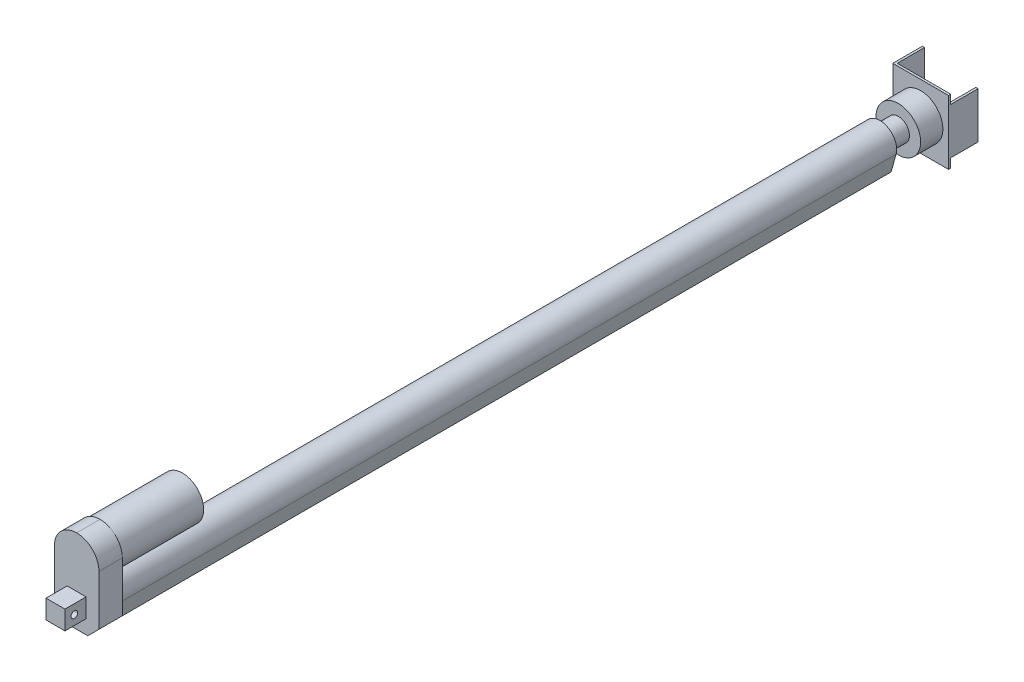
ISO-10303-21;
HEADER;
FILE_DESCRIPTION(('STEP AP214'),'2;1');
FILE_NAME('part.step','',(''),(''),'','','');
FILE_SCHEMA(('AUTOMOTIVE_DESIGN { 1 0 10303 214 1 1 1 1 }'));
ENDSEC;
DATA;
#1=APPLICATION_CONTEXT('core data for automotive mechanical design processes');
#2=APPLICATION_PROTOCOL_DEFINITION('international standard','automotive_design',2000,#1);
#3=PRODUCT_CONTEXT('',#1,'mechanical');
#4=PRODUCT('Part','Part','',(#3));
#5=PRODUCT_RELATED_PRODUCT_CATEGORY('part','',(#4));
#6=PRODUCT_DEFINITION_FORMATION('','',#4);
#7=PRODUCT_DEFINITION_CONTEXT('part definition',#1,'design');
#8=PRODUCT_DEFINITION('design','',#6,#7);
#9=PRODUCT_DEFINITION_SHAPE('','',#8);
#10=(LENGTH_UNIT() NAMED_UNIT(*) SI_UNIT(.MILLI.,.METRE.));
#11=(NAMED_UNIT(*) PLANE_ANGLE_UNIT() SI_UNIT($,.RADIAN.));
#12=(NAMED_UNIT(*) SI_UNIT($,.STERADIAN.) SOLID_ANGLE_UNIT());
#13=UNCERTAINTY_MEASURE_WITH_UNIT(LENGTH_MEASURE(1.E-05),#10,'distance_accuracy_value','');
#14=(GEOMETRIC_REPRESENTATION_CONTEXT(3) GLOBAL_UNCERTAINTY_ASSIGNED_CONTEXT((#13)) GLOBAL_UNIT_ASSIGNED_CONTEXT((#10,
#11,#12)) REPRESENTATION_CONTEXT('',''));
#15=CARTESIAN_POINT('',(0.,0.,0.));
#16=DIRECTION('',(0.,0.,1.));
#17=DIRECTION('',(1.,0.,0.));
#18=AXIS2_PLACEMENT_3D('',#15,#16,#17);
#19=CARTESIAN_POINT('',(0.,0.,-738.5));
#20=DIRECTION('',(0.,0.,-1.));
#21=DIRECTION('',(-1.,0.,0.));
#22=AXIS2_PLACEMENT_3D('',#19,#20,#21);
#23=PLANE('',#22);
#24=DIRECTION('',(0.,1.,0.));
#25=VECTOR('',#24,1.);
#26=CARTESIAN_POINT('',(23.,3.24999999999999,-738.5));
#27=LINE('',#26,#25);
#28=CARTESIAN_POINT('',(23.,-38.25,-738.5));
#29=VERTEX_POINT('',#28);
#30=CARTESIAN_POINT('',(23.,3.24999999999999,-738.5));
#31=VERTEX_POINT('',#30);
#32=EDGE_CURVE('E832',#29,#31,#27,.T.);
#33=ORIENTED_EDGE('',*,*,#32,.F.);
#34=DIRECTION('',(-1.,0.,0.));
#35=VECTOR('',#34,1.);
#36=CARTESIAN_POINT('',(25.,-38.25,-738.5));
#37=LINE('',#36,#35);
#38=CARTESIAN_POINT('',(25.,-38.25,-738.5));
#39=VERTEX_POINT('',#38);
#40=EDGE_CURVE('E849',#39,#29,#37,.T.);
#41=ORIENTED_EDGE('',*,*,#40,.F.);
#42=DIRECTION('',(0.,-1.,0.));
#43=VECTOR('',#42,1.);
#44=CARTESIAN_POINT('',(25.,11.25,-738.5));
#45=LINE('',#44,#43);
#46=CARTESIAN_POINT('',(25.,-46.25,-738.5));
#47=VERTEX_POINT('',#46);
#48=EDGE_CURVE('E239',#39,#47,#45,.T.);
#49=ORIENTED_EDGE('',*,*,#48,.T.);
#50=DIRECTION('',(-1.,0.,0.));
#51=VECTOR('',#50,1.);
#52=CARTESIAN_POINT('',(25.,-46.25,-738.5));
#53=LINE('',#52,#51);
#54=CARTESIAN_POINT('',(-23.,-46.25,-738.5));
#55=VERTEX_POINT('',#54);
#56=EDGE_CURVE('E275',#47,#55,#53,.T.);
#57=ORIENTED_EDGE('',*,*,#56,.T.);
#58=DIRECTION('',(0.,-1.,0.));
#59=VECTOR('',#58,1.);
#60=CARTESIAN_POINT('',(-23.,11.25,-738.5));
#61=LINE('',#60,#59);
#62=CARTESIAN_POINT('',(-23.,11.25,-738.5));
#63=VERTEX_POINT('',#62);
#64=EDGE_CURVE('E74',#63,#55,#61,.T.);
#65=ORIENTED_EDGE('',*,*,#64,.F.);
#66=DIRECTION('',(1.,0.,0.));
#67=VECTOR('',#66,1.);
#68=CARTESIAN_POINT('',(25.,11.25,-738.5));
#69=LINE('',#68,#67);
#70=CARTESIAN_POINT('',(25.,11.25,-738.5));
#71=VERTEX_POINT('',#70);
#72=EDGE_CURVE('E278',#63,#71,#69,.T.);
#73=ORIENTED_EDGE('',*,*,#72,.T.);
#74=CARTESIAN_POINT('',(25.,3.24999999999999,-738.5));
#75=VERTEX_POINT('',#74);
#76=EDGE_CURVE('E271',#71,#75,#45,.T.);
#77=ORIENTED_EDGE('',*,*,#76,.T.);
#78=DIRECTION('',(1.,0.,0.));
#79=VECTOR('',#78,1.);
#80=CARTESIAN_POINT('',(25.,3.24999999999999,-738.5));
#81=LINE('',#80,#79);
#82=EDGE_CURVE('E233',#31,#75,#81,.T.);
#83=ORIENTED_EDGE('',*,*,#82,.F.);
#84=EDGE_LOOP('',(#33,#41,#49,#57,#65,#73,#77,#83));
#85=FACE_BOUND('',#84,.T.);
#86=ADVANCED_FACE('F47',(#85),#23,.T.);
#87=CARTESIAN_POINT('',(0.,0.,0.));
#88=DIRECTION('',(0.,0.,1.));
#89=DIRECTION('',(1.,0.,0.));
#90=AXIS2_PLACEMENT_3D('',#87,#88,#89);
#91=PLANE('',#90);
#92=CARTESIAN_POINT('',(0.,17.5,0.));
#93=DIRECTION('',(0.,0.,1.));
#94=DIRECTION('',(1.,0.,0.));
#95=AXIS2_PLACEMENT_3D('',#92,#93,#94);
#96=CIRCLE('',#95,19.);
#97=CARTESIAN_POINT('',(19.,17.5,0.));
#98=VERTEX_POINT('',#97);
#99=EDGE_CURVE('E58',#98,#98,#96,.F.);
#100=ORIENTED_EDGE('',*,*,#99,.F.);
#101=EDGE_LOOP('',(#100));
#102=FACE_BOUND('',#101,.T.);
#103=DIRECTION('',(-0.26833752096446,0.96332495807108,0.));
#104=VECTOR('',#103,1.);
#105=CARTESIAN_POINT('',(-10.,-37.5,0.));
#106=LINE('',#105,#104);
#107=CARTESIAN_POINT('',(-10.,-37.5,0.));
#108=VERTEX_POINT('',#107);
#109=CARTESIAN_POINT('',(-14.4498743710662,-21.5250628144669,0.));
#110=VERTEX_POINT('',#109);
#111=EDGE_CURVE('E379',#108,#110,#106,.T.);
#112=ORIENTED_EDGE('',*,*,#111,.F.);
#113=DIRECTION('',(0.707106781186546,-0.707106781186549,0.));
#114=VECTOR('',#113,1.);
#115=CARTESIAN_POINT('',(-10.,-37.5,0.));
#116=LINE('',#115,#114);
#117=CARTESIAN_POINT('',(-20.,-27.5,0.));
#118=VERTEX_POINT('',#117);
#119=EDGE_CURVE('E468',#108,#118,#116,.F.);
#120=ORIENTED_EDGE('',*,*,#119,.T.);
#121=DIRECTION('',(0.,-1.,0.));
#122=VECTOR('',#121,1.);
#123=CARTESIAN_POINT('',(-20.,37.5,0.));
#124=LINE('',#123,#122);
#125=CARTESIAN_POINT('',(-20.,17.5,0.));
#126=VERTEX_POINT('',#125);
#127=EDGE_CURVE('E428',#126,#118,#124,.T.);
#128=ORIENTED_EDGE('',*,*,#127,.F.);
#129=CARTESIAN_POINT('',(0.,17.5,0.));
#130=DIRECTION('',(0.,0.,1.));
#131=DIRECTION('',(1.,0.,0.));
#132=AXIS2_PLACEMENT_3D('',#129,#130,#131);
#133=CIRCLE('',#132,20.);
#134=CARTESIAN_POINT('',(0.,37.5,0.));
#135=VERTEX_POINT('',#134);
#136=EDGE_CURVE('E441',#126,#135,#133,.F.);
#137=ORIENTED_EDGE('',*,*,#136,.T.);
#138=CARTESIAN_POINT('',(0.,17.5,0.));
#139=DIRECTION('',(0.,0.,1.));
#140=DIRECTION('',(1.,0.,0.));
#141=AXIS2_PLACEMENT_3D('',#138,#139,#140);
#142=CIRCLE('',#141,20.);
#143=CARTESIAN_POINT('',(20.,17.5,0.));
#144=VERTEX_POINT('',#143);
#145=EDGE_CURVE('E437',#135,#144,#142,.F.);
#146=ORIENTED_EDGE('',*,*,#145,.T.);
#147=DIRECTION('',(0.,1.,0.));
#148=VECTOR('',#147,1.);
#149=CARTESIAN_POINT('',(20.,37.5,0.));
#150=LINE('',#149,#148);
#151=CARTESIAN_POINT('',(20.,-27.5,0.));
#152=VERTEX_POINT('',#151);
#153=EDGE_CURVE('E420',#152,#144,#150,.T.);
#154=ORIENTED_EDGE('',*,*,#153,.F.);
#155=DIRECTION('',(0.707106781186548,0.707106781186547,0.));
#156=VECTOR('',#155,1.);
#157=CARTESIAN_POINT('',(20.,-27.5,0.));
#158=LINE('',#157,#156);
#159=CARTESIAN_POINT('',(9.99999999999996,-37.5,0.));
#160=VERTEX_POINT('',#159);
#161=EDGE_CURVE('E464',#152,#160,#158,.F.);
#162=ORIENTED_EDGE('',*,*,#161,.T.);
#163=DIRECTION('',(-0.268337520964462,-0.963324958071079,0.));
#164=VECTOR('',#163,1.);
#165=CARTESIAN_POINT('',(9.99999999999996,-37.5,0.));
#166=LINE('',#165,#164);
#167=CARTESIAN_POINT('',(14.4498743710662,-21.5250628144669,0.));
#168=VERTEX_POINT('',#167);
#169=EDGE_CURVE('E392',#168,#160,#166,.T.);
#170=ORIENTED_EDGE('',*,*,#169,.F.);
#171=CARTESIAN_POINT('',(0.,-17.5,0.));
#172=DIRECTION('',(0.,0.,-1.));
#173=DIRECTION('',(-1.,0.,0.));
#174=AXIS2_PLACEMENT_3D('',#171,#172,#173);
#175=CIRCLE('',#174,15.);
#176=EDGE_CURVE('E373',#110,#168,#175,.T.);
#177=ORIENTED_EDGE('',*,*,#176,.F.);
#178=EDGE_LOOP('',(#112,#120,#128,#137,#146,#154,#162,#170,#177));
#179=FACE_BOUND('',#178,.T.);
#180=ADVANCED_FACE('F489',(#102,#179),#91,.F.);
#181=CARTESIAN_POINT('',(-20.,37.5,21.));
#182=DIRECTION('',(1.,0.,0.));
#183=DIRECTION('',(0.,1.,0.));
#184=AXIS2_PLACEMENT_3D('',#181,#182,#183);
#185=PLANE('',#184);
#186=ORIENTED_EDGE('',*,*,#127,.T.);
#187=DIRECTION('',(0.,0.,1.));
#188=VECTOR('',#187,1.);
#189=CARTESIAN_POINT('',(-20.,-27.5,21.));
#190=LINE('',#189,#188);
#191=CARTESIAN_POINT('',(-20.,-27.5,21.));
#192=VERTEX_POINT('',#191);
#193=EDGE_CURVE('E471',#118,#192,#190,.T.);
#194=ORIENTED_EDGE('',*,*,#193,.T.);
#195=DIRECTION('',(0.,-1.,0.));
#196=VECTOR('',#195,1.);
#197=CARTESIAN_POINT('',(-20.,37.5,21.));
#198=LINE('',#197,#196);
#199=CARTESIAN_POINT('',(-20.,17.5,21.));
#200=VERTEX_POINT('',#199);
#201=EDGE_CURVE('E415',#200,#192,#198,.T.);
#202=ORIENTED_EDGE('',*,*,#201,.F.);
#203=DIRECTION('',(0.,0.,-1.));
#204=VECTOR('',#203,1.);
#205=CARTESIAN_POINT('',(-20.,17.5,21.));
#206=LINE('',#205,#204);
#207=EDGE_CURVE('E427',#200,#126,#206,.T.);
#208=ORIENTED_EDGE('',*,*,#207,.T.);
#209=EDGE_LOOP('',(#186,#194,#202,#208));
#210=FACE_BOUND('',#209,.T.);
#211=ADVANCED_FACE('F492',(#210),#185,.F.);
#212=CARTESIAN_POINT('',(-20.,-37.5,21.));
#213=DIRECTION('',(0.,1.,0.));
#214=DIRECTION('',(-1.,0.,0.));
#215=AXIS2_PLACEMENT_3D('',#212,#213,#214);
#216=PLANE('',#215);
#217=DIRECTION('',(1.,0.,0.));
#218=VECTOR('',#217,1.);
#219=CARTESIAN_POINT('',(-20.,-37.5,21.));
#220=LINE('',#219,#218);
#221=CARTESIAN_POINT('',(-10.,-37.5,21.));
#222=VERTEX_POINT('',#221);
#223=CARTESIAN_POINT('',(9.99999999999996,-37.5,21.));
#224=VERTEX_POINT('',#223);
#225=EDGE_CURVE('E419',#222,#224,#220,.T.);
#226=ORIENTED_EDGE('',*,*,#225,.F.);
#227=DIRECTION('',(0.,0.,-1.));
#228=VECTOR('',#227,1.);
#229=CARTESIAN_POINT('',(-10.,-37.5,21.));
#230=LINE('',#229,#228);
#231=EDGE_CURVE('E460',#222,#108,#230,.T.);
#232=ORIENTED_EDGE('',*,*,#231,.T.);
#233=DIRECTION('',(0.,0.,1.));
#234=VECTOR('',#233,1.);
#235=CARTESIAN_POINT('',(-10.,-37.5,-700.));
#236=LINE('',#235,#234);
#237=CARTESIAN_POINT('',(-10.,-37.5,-700.));
#238=VERTEX_POINT('',#237);
#239=EDGE_CURVE('E402',#238,#108,#236,.T.);
#240=ORIENTED_EDGE('',*,*,#239,.F.);
#241=DIRECTION('',(-1.,0.,0.));
#242=VECTOR('',#241,1.);
#243=CARTESIAN_POINT('',(9.99999999999996,-37.5,-700.));
#244=LINE('',#243,#242);
#245=CARTESIAN_POINT('',(9.99999999999996,-37.5,-700.));
#246=VERTEX_POINT('',#245);
#247=EDGE_CURVE('E382',#246,#238,#244,.T.);
#248=ORIENTED_EDGE('',*,*,#247,.F.);
#249=DIRECTION('',(0.,0.,1.));
#250=VECTOR('',#249,1.);
#251=CARTESIAN_POINT('',(9.99999999999996,-37.5,-700.));
#252=LINE('',#251,#250);
#253=EDGE_CURVE('E406',#246,#160,#252,.T.);
#254=ORIENTED_EDGE('',*,*,#253,.T.);
#255=DIRECTION('',(0.,0.,1.));
#256=VECTOR('',#255,1.);
#257=CARTESIAN_POINT('',(9.99999999999996,-37.5,21.));
#258=LINE('',#257,#256);
#259=EDGE_CURVE('E454',#160,#224,#258,.T.);
#260=ORIENTED_EDGE('',*,*,#259,.T.);
#261=EDGE_LOOP('',(#226,#232,#240,#248,#254,#260));
#262=FACE_BOUND('',#261,.T.);
#263=ADVANCED_FACE('F506',(#262),#216,.F.);
#264=CARTESIAN_POINT('',(20.,37.5,21.));
#265=DIRECTION('',(-1.,0.,0.));
#266=DIRECTION('',(0.,-1.,0.));
#267=AXIS2_PLACEMENT_3D('',#264,#265,#266);
#268=PLANE('',#267);
#269=DIRECTION('',(0.,1.,0.));
#270=VECTOR('',#269,1.);
#271=CARTESIAN_POINT('',(20.,37.5,21.));
#272=LINE('',#271,#270);
#273=CARTESIAN_POINT('',(20.,-27.5,21.));
#274=VERTEX_POINT('',#273);
#275=CARTESIAN_POINT('',(20.,17.5,21.));
#276=VERTEX_POINT('',#275);
#277=EDGE_CURVE('E424',#274,#276,#272,.T.);
#278=ORIENTED_EDGE('',*,*,#277,.F.);
#279=DIRECTION('',(0.,0.,-1.));
#280=VECTOR('',#279,1.);
#281=CARTESIAN_POINT('',(20.,-27.5,21.));
#282=LINE('',#281,#280);
#283=EDGE_CURVE('E480',#274,#152,#282,.T.);
#284=ORIENTED_EDGE('',*,*,#283,.T.);
#285=ORIENTED_EDGE('',*,*,#153,.T.);
#286=DIRECTION('',(0.,0.,-1.));
#287=VECTOR('',#286,1.);
#288=CARTESIAN_POINT('',(20.,17.5,21.));
#289=LINE('',#288,#287);
#290=EDGE_CURVE('E450',#144,#276,#289,.F.);
#291=ORIENTED_EDGE('',*,*,#290,.T.);
#292=EDGE_LOOP('',(#278,#284,#285,#291));
#293=FACE_BOUND('',#292,.T.);
#294=ADVANCED_FACE('F523',(#293),#268,.F.);
#295=CARTESIAN_POINT('',(0.,0.,21.));
#296=DIRECTION('',(0.,0.,1.));
#297=DIRECTION('',(1.,0.,0.));
#298=AXIS2_PLACEMENT_3D('',#295,#296,#297);
#299=PLANE('',#298);
#300=DIRECTION('',(0.,-1.,0.));
#301=VECTOR('',#300,1.);
#302=CARTESIAN_POINT('',(-8.5,-8.,21.));
#303=LINE('',#302,#301);
#304=CARTESIAN_POINT('',(-8.5,-8.,21.));
#305=VERTEX_POINT('',#304);
#306=CARTESIAN_POINT('',(-8.5,-25.,21.));
#307=VERTEX_POINT('',#306);
#308=EDGE_CURVE('E339',#305,#307,#303,.T.);
#309=ORIENTED_EDGE('',*,*,#308,.F.);
#310=DIRECTION('',(-1.,0.,0.));
#311=VECTOR('',#310,1.);
#312=CARTESIAN_POINT('',(-8.5,-8.,21.));
#313=LINE('',#312,#311);
#314=CARTESIAN_POINT('',(8.5,-8.,21.));
#315=VERTEX_POINT('',#314);
#316=EDGE_CURVE('E329',#315,#305,#313,.T.);
#317=ORIENTED_EDGE('',*,*,#316,.F.);
#318=DIRECTION('',(0.,1.,0.));
#319=VECTOR('',#318,1.);
#320=CARTESIAN_POINT('',(8.5,-8.,21.));
#321=LINE('',#320,#319);
#322=CARTESIAN_POINT('',(8.5,-25.,21.));
#323=VERTEX_POINT('',#322);
#324=EDGE_CURVE('E347',#323,#315,#321,.T.);
#325=ORIENTED_EDGE('',*,*,#324,.F.);
#326=DIRECTION('',(1.,0.,0.));
#327=VECTOR('',#326,1.);
#328=CARTESIAN_POINT('',(-8.5,-25.,21.));
#329=LINE('',#328,#327);
#330=EDGE_CURVE('E343',#307,#323,#329,.T.);
#331=ORIENTED_EDGE('',*,*,#330,.F.);
#332=EDGE_LOOP('',(#309,#317,#325,#331));
#333=FACE_BOUND('',#332,.T.);
#334=ORIENTED_EDGE('',*,*,#201,.T.);
#335=DIRECTION('',(-0.707106781186546,0.707106781186549,0.));
#336=VECTOR('',#335,1.);
#337=CARTESIAN_POINT('',(-23.75,-23.7499999999999,21.));
#338=LINE('',#337,#336);
#339=EDGE_CURVE('E477',#192,#222,#338,.F.);
#340=ORIENTED_EDGE('',*,*,#339,.T.);
#341=ORIENTED_EDGE('',*,*,#225,.T.);
#342=DIRECTION('',(-0.707106781186548,-0.707106781186547,0.));
#343=VECTOR('',#342,1.);
#344=CARTESIAN_POINT('',(23.75,-23.75,21.));
#345=LINE('',#344,#343);
#346=EDGE_CURVE('E474',#224,#274,#345,.F.);
#347=ORIENTED_EDGE('',*,*,#346,.T.);
#348=ORIENTED_EDGE('',*,*,#277,.T.);
#349=CARTESIAN_POINT('',(0.,17.5,21.));
#350=DIRECTION('',(0.,0.,1.));
#351=DIRECTION('',(1.,0.,0.));
#352=AXIS2_PLACEMENT_3D('',#349,#350,#351);
#353=CIRCLE('',#352,20.);
#354=CARTESIAN_POINT('',(0.,37.5,21.));
#355=VERTEX_POINT('',#354);
#356=EDGE_CURVE('E444',#276,#355,#353,.T.);
#357=ORIENTED_EDGE('',*,*,#356,.T.);
#358=CARTESIAN_POINT('',(0.,17.5,21.));
#359=DIRECTION('',(0.,0.,1.));
#360=DIRECTION('',(1.,0.,0.));
#361=AXIS2_PLACEMENT_3D('',#358,#359,#360);
#362=CIRCLE('',#361,20.);
#363=EDGE_CURVE('E447',#355,#200,#362,.T.);
#364=ORIENTED_EDGE('',*,*,#363,.T.);
#365=EDGE_LOOP('',(#334,#340,#341,#347,#348,#357,#364));
#366=FACE_BOUND('',#365,.T.);
#367=ADVANCED_FACE('F527',(#333,#366),#299,.T.);
#368=CARTESIAN_POINT('',(0.,17.5,21.));
#369=DIRECTION('',(0.,0.,-1.));
#370=DIRECTION('',(-1.,0.,0.));
#371=AXIS2_PLACEMENT_3D('',#368,#369,#370);
#372=CYLINDRICAL_SURFACE('',#371,20.);
#373=DIRECTION('',(0.,0.,-1.));
#374=VECTOR('',#373,1.);
#375=CARTESIAN_POINT('',(0.,37.5,21.));
#376=LINE('',#375,#374);
#377=EDGE_CURVE('E414',#355,#135,#376,.T.);
#378=ORIENTED_EDGE('',*,*,#377,.F.);
#379=ORIENTED_EDGE('',*,*,#356,.F.);
#380=ORIENTED_EDGE('',*,*,#290,.F.);
#381=ORIENTED_EDGE('',*,*,#145,.F.);
#382=EDGE_LOOP('',(#378,#379,#380,#381));
#383=FACE_BOUND('',#382,.T.);
#384=ADVANCED_FACE('F537',(#383),#372,.T.);
#385=CARTESIAN_POINT('',(0.,17.5,21.));
#386=DIRECTION('',(0.,0.,-1.));
#387=DIRECTION('',(-1.,0.,0.));
#388=AXIS2_PLACEMENT_3D('',#385,#386,#387);
#389=CYLINDRICAL_SURFACE('',#388,20.);
#390=ORIENTED_EDGE('',*,*,#363,.F.);
#391=ORIENTED_EDGE('',*,*,#377,.T.);
#392=ORIENTED_EDGE('',*,*,#136,.F.);
#393=ORIENTED_EDGE('',*,*,#207,.F.);
#394=EDGE_LOOP('',(#390,#391,#392,#393));
#395=FACE_BOUND('',#394,.T.);
#396=ADVANCED_FACE('F534',(#395),#389,.T.);
#397=CARTESIAN_POINT('',(-10.,-37.5,21.));
#398=DIRECTION('',(0.707106781186549,0.707106781186546,0.));
#399=DIRECTION('',(0.,0.,-1.));
#400=AXIS2_PLACEMENT_3D('',#397,#398,#399);
#401=PLANE('',#400);
#402=ORIENTED_EDGE('',*,*,#339,.F.);
#403=ORIENTED_EDGE('',*,*,#193,.F.);
#404=ORIENTED_EDGE('',*,*,#119,.F.);
#405=ORIENTED_EDGE('',*,*,#231,.F.);
#406=EDGE_LOOP('',(#402,#403,#404,#405));
#407=FACE_BOUND('',#406,.T.);
#408=ADVANCED_FACE('F502',(#407),#401,.F.);
#409=CARTESIAN_POINT('',(20.,-27.5,21.));
#410=DIRECTION('',(-0.707106781186547,0.707106781186548,0.));
#411=DIRECTION('',(0.,0.,-1.));
#412=AXIS2_PLACEMENT_3D('',#409,#410,#411);
#413=PLANE('',#412);
#414=ORIENTED_EDGE('',*,*,#346,.F.);
#415=ORIENTED_EDGE('',*,*,#259,.F.);
#416=ORIENTED_EDGE('',*,*,#161,.F.);
#417=ORIENTED_EDGE('',*,*,#283,.F.);
#418=EDGE_LOOP('',(#414,#415,#416,#417));
#419=FACE_BOUND('',#418,.T.);
#420=ADVANCED_FACE('F50',(#419),#413,.F.);
#421=CARTESIAN_POINT('',(0.,-17.5,-700.));
#422=DIRECTION('',(0.,0.,1.));
#423=DIRECTION('',(1.,0.,0.));
#424=AXIS2_PLACEMENT_3D('',#421,#422,#423);
#425=CYLINDRICAL_SURFACE('',#424,15.);
#426=ORIENTED_EDGE('',*,*,#176,.T.);
#427=DIRECTION('',(0.,0.,1.));
#428=VECTOR('',#427,1.);
#429=CARTESIAN_POINT('',(14.4498743710662,-21.5250628144669,-700.));
#430=LINE('',#429,#428);
#431=CARTESIAN_POINT('',(14.4498743710662,-21.5250628144669,-700.));
#432=VERTEX_POINT('',#431);
#433=EDGE_CURVE('E410',#432,#168,#430,.T.);
#434=ORIENTED_EDGE('',*,*,#433,.F.);
#435=CARTESIAN_POINT('',(0.,-17.5,-700.));
#436=DIRECTION('',(0.,0.,-1.));
#437=DIRECTION('',(-1.,0.,0.));
#438=AXIS2_PLACEMENT_3D('',#435,#436,#437);
#439=CIRCLE('',#438,15.);
#440=CARTESIAN_POINT('',(-14.4498743710662,-21.5250628144669,-700.));
#441=VERTEX_POINT('',#440);
#442=EDGE_CURVE('E374',#441,#432,#439,.T.);
#443=ORIENTED_EDGE('',*,*,#442,.F.);
#444=DIRECTION('',(0.,0.,1.));
#445=VECTOR('',#444,1.);
#446=CARTESIAN_POINT('',(-14.4498743710662,-21.5250628144669,-700.));
#447=LINE('',#446,#445);
#448=EDGE_CURVE('E388',#441,#110,#447,.T.);
#449=ORIENTED_EDGE('',*,*,#448,.T.);
#450=EDGE_LOOP('',(#426,#434,#443,#449));
#451=FACE_BOUND('',#450,.T.);
#452=ADVANCED_FACE('F625',(#451),#425,.T.);
#453=CARTESIAN_POINT('',(9.99999999999996,-37.5,-700.));
#454=DIRECTION('',(-0.963324958071079,0.268337520964462,0.));
#455=DIRECTION('',(-0.268337520964462,-0.963324958071079,0.));
#456=AXIS2_PLACEMENT_3D('',#453,#454,#455);
#457=PLANE('',#456);
#458=ORIENTED_EDGE('',*,*,#169,.T.);
#459=ORIENTED_EDGE('',*,*,#253,.F.);
#460=DIRECTION('',(-0.268337520964462,-0.963324958071079,0.));
#461=VECTOR('',#460,1.);
#462=CARTESIAN_POINT('',(9.99999999999996,-37.5,-700.));
#463=LINE('',#462,#461);
#464=EDGE_CURVE('E378',#432,#246,#463,.T.);
#465=ORIENTED_EDGE('',*,*,#464,.F.);
#466=ORIENTED_EDGE('',*,*,#433,.T.);
#467=EDGE_LOOP('',(#458,#459,#465,#466));
#468=FACE_BOUND('',#467,.T.);
#469=ADVANCED_FACE('F516',(#468),#457,.F.);
#470=CARTESIAN_POINT('',(-10.,-37.5,-700.));
#471=DIRECTION('',(0.96332495807108,0.26833752096446,0.));
#472=DIRECTION('',(-0.26833752096446,0.96332495807108,0.));
#473=AXIS2_PLACEMENT_3D('',#470,#471,#472);
#474=PLANE('',#473);
#475=ORIENTED_EDGE('',*,*,#111,.T.);
#476=ORIENTED_EDGE('',*,*,#448,.F.);
#477=DIRECTION('',(-0.26833752096446,0.96332495807108,0.));
#478=VECTOR('',#477,1.);
#479=CARTESIAN_POINT('',(-10.,-37.5,-700.));
#480=LINE('',#479,#478);
#481=EDGE_CURVE('E385',#238,#441,#480,.T.);
#482=ORIENTED_EDGE('',*,*,#481,.F.);
#483=ORIENTED_EDGE('',*,*,#239,.T.);
#484=EDGE_LOOP('',(#475,#476,#482,#483));
#485=FACE_BOUND('',#484,.T.);
#486=ADVANCED_FACE('F509',(#485),#474,.F.);
#487=CARTESIAN_POINT('',(0.,-17.5,-700.));
#488=DIRECTION('',(0.,0.,-1.));
#489=DIRECTION('',(-1.,0.,0.));
#490=AXIS2_PLACEMENT_3D('',#487,#488,#489);
#491=PLANE('',#490);
#492=CARTESIAN_POINT('',(0.,-17.5,-700.));
#493=DIRECTION('',(0.,0.,-1.));
#494=DIRECTION('',(-1.,0.,0.));
#495=AXIS2_PLACEMENT_3D('',#492,#493,#494);
#496=CIRCLE('',#495,10.);
#497=CARTESIAN_POINT('',(-10.,-17.5,-700.));
#498=VERTEX_POINT('',#497);
#499=EDGE_CURVE('E11',#498,#498,#496,.T.);
#500=ORIENTED_EDGE('',*,*,#499,.F.);
#501=EDGE_LOOP('',(#500));
#502=FACE_BOUND('',#501,.T.);
#503=ORIENTED_EDGE('',*,*,#442,.T.);
#504=ORIENTED_EDGE('',*,*,#464,.T.);
#505=ORIENTED_EDGE('',*,*,#247,.T.);
#506=ORIENTED_EDGE('',*,*,#481,.T.);
#507=EDGE_LOOP('',(#503,#504,#505,#506));
#508=FACE_BOUND('',#507,.T.);
#509=ADVANCED_FACE('F512',(#502,#508),#491,.T.);
#510=CARTESIAN_POINT('',(0.,17.5,-74.));
#511=DIRECTION('',(0.,0.,1.));
#512=DIRECTION('',(1.,0.,0.));
#513=AXIS2_PLACEMENT_3D('',#510,#511,#512);
#514=CYLINDRICAL_SURFACE('',#513,19.);
#515=CARTESIAN_POINT('',(0.,17.5,-74.));
#516=DIRECTION('',(0.,0.,-1.));
#517=DIRECTION('',(-1.,0.,0.));
#518=AXIS2_PLACEMENT_3D('',#515,#516,#517);
#519=CIRCLE('',#518,19.);
#520=CARTESIAN_POINT('',(-19.,17.5,-74.));
#521=VERTEX_POINT('',#520);
#522=EDGE_CURVE('E369',#521,#521,#519,.T.);
#523=ORIENTED_EDGE('',*,*,#522,.F.);
#524=EDGE_LOOP('',(#523));
#525=FACE_BOUND('',#524,.T.);
#526=ORIENTED_EDGE('',*,*,#99,.T.);
#527=EDGE_LOOP('',(#526));
#528=FACE_BOUND('',#527,.T.);
#529=ADVANCED_FACE('F487',(#525,#528),#514,.T.);
#530=CARTESIAN_POINT('',(0.,17.5,-74.));
#531=DIRECTION('',(0.,0.,-1.));
#532=DIRECTION('',(-1.,0.,0.));
#533=AXIS2_PLACEMENT_3D('',#530,#531,#532);
#534=PLANE('',#533);
#535=ORIENTED_EDGE('',*,*,#522,.T.);
#536=EDGE_LOOP('',(#535));
#537=FACE_BOUND('',#536,.T.);
#538=ADVANCED_FACE('F610',(#537),#534,.T.);
#539=CARTESIAN_POINT('',(-8.5,-8.,40.));
#540=DIRECTION('',(1.,0.,0.));
#541=DIRECTION('',(0.,1.,0.));
#542=AXIS2_PLACEMENT_3D('',#539,#540,#541);
#543=PLANE('',#542);
#544=CARTESIAN_POINT('',(-8.5,-16.5,31.5));
#545=DIRECTION('',(-1.,0.,0.));
#546=DIRECTION('',(0.,-1.,0.));
#547=AXIS2_PLACEMENT_3D('',#544,#545,#546);
#548=CIRCLE('',#547,3.);
#549=CARTESIAN_POINT('',(-8.5,-19.5,31.5));
#550=VERTEX_POINT('',#549);
#551=EDGE_CURVE('E319',#550,#550,#548,.T.);
#552=ORIENTED_EDGE('',*,*,#551,.F.);
#553=EDGE_LOOP('',(#552));
#554=FACE_BOUND('',#553,.T.);
#555=ORIENTED_EDGE('',*,*,#308,.T.);
#556=DIRECTION('',(0.,0.,-1.));
#557=VECTOR('',#556,1.);
#558=CARTESIAN_POINT('',(-8.5,-25.,40.));
#559=LINE('',#558,#557);
#560=CARTESIAN_POINT('',(-8.5,-25.,40.));
#561=VERTEX_POINT('',#560);
#562=EDGE_CURVE('E365',#561,#307,#559,.T.);
#563=ORIENTED_EDGE('',*,*,#562,.F.);
#564=DIRECTION('',(0.,-1.,0.));
#565=VECTOR('',#564,1.);
#566=CARTESIAN_POINT('',(-8.5,-8.,40.));
#567=LINE('',#566,#565);
#568=CARTESIAN_POINT('',(-8.5,-8.,40.));
#569=VERTEX_POINT('',#568);
#570=EDGE_CURVE('E324',#569,#561,#567,.T.);
#571=ORIENTED_EDGE('',*,*,#570,.F.);
#572=DIRECTION('',(0.,0.,-1.));
#573=VECTOR('',#572,1.);
#574=CARTESIAN_POINT('',(-8.5,-8.,40.));
#575=LINE('',#574,#573);
#576=EDGE_CURVE('E338',#569,#305,#575,.T.);
#577=ORIENTED_EDGE('',*,*,#576,.T.);
#578=EDGE_LOOP('',(#555,#563,#571,#577));
#579=FACE_BOUND('',#578,.T.);
#580=ADVANCED_FACE('F606',(#554,#579),#543,.F.);
#581=CARTESIAN_POINT('',(-8.5,-25.,40.));
#582=DIRECTION('',(0.,1.,0.));
#583=DIRECTION('',(0.,0.,1.));
#584=AXIS2_PLACEMENT_3D('',#581,#582,#583);
#585=PLANE('',#584);
#586=ORIENTED_EDGE('',*,*,#330,.T.);
#587=DIRECTION('',(0.,0.,-1.));
#588=VECTOR('',#587,1.);
#589=CARTESIAN_POINT('',(8.5,-25.,40.));
#590=LINE('',#589,#588);
#591=CARTESIAN_POINT('',(8.5,-25.,40.));
#592=VERTEX_POINT('',#591);
#593=EDGE_CURVE('E361',#592,#323,#590,.T.);
#594=ORIENTED_EDGE('',*,*,#593,.F.);
#595=DIRECTION('',(1.,0.,0.));
#596=VECTOR('',#595,1.);
#597=CARTESIAN_POINT('',(-8.5,-25.,40.));
#598=LINE('',#597,#596);
#599=EDGE_CURVE('E328',#561,#592,#598,.T.);
#600=ORIENTED_EDGE('',*,*,#599,.F.);
#601=ORIENTED_EDGE('',*,*,#562,.T.);
#602=EDGE_LOOP('',(#586,#594,#600,#601));
#603=FACE_BOUND('',#602,.T.);
#604=ADVANCED_FACE('F602',(#603),#585,.F.);
#605=CARTESIAN_POINT('',(8.5,-8.,40.));
#606=DIRECTION('',(-1.,0.,0.));
#607=DIRECTION('',(0.,0.,1.));
#608=AXIS2_PLACEMENT_3D('',#605,#606,#607);
#609=PLANE('',#608);
#610=CARTESIAN_POINT('',(8.5,-16.5,31.5));
#611=DIRECTION('',(-1.,0.,0.));
#612=DIRECTION('',(0.,0.,1.));
#613=AXIS2_PLACEMENT_3D('',#610,#611,#612);
#614=CIRCLE('',#613,3.);
#615=CARTESIAN_POINT('',(8.5,-16.5,34.5));
#616=VERTEX_POINT('',#615);
#617=EDGE_CURVE('E52',#616,#616,#614,.T.);
#618=ORIENTED_EDGE('',*,*,#617,.T.);
#619=EDGE_LOOP('',(#618));
#620=FACE_BOUND('',#619,.T.);
#621=ORIENTED_EDGE('',*,*,#324,.T.);
#622=DIRECTION('',(0.,0.,-1.));
#623=VECTOR('',#622,1.);
#624=CARTESIAN_POINT('',(8.5,-8.,40.));
#625=LINE('',#624,#623);
#626=CARTESIAN_POINT('',(8.5,-8.,40.));
#627=VERTEX_POINT('',#626);
#628=EDGE_CURVE('E357',#627,#315,#625,.T.);
#629=ORIENTED_EDGE('',*,*,#628,.F.);
#630=DIRECTION('',(0.,1.,0.));
#631=VECTOR('',#630,1.);
#632=CARTESIAN_POINT('',(8.5,-8.,40.));
#633=LINE('',#632,#631);
#634=EDGE_CURVE('E332',#592,#627,#633,.T.);
#635=ORIENTED_EDGE('',*,*,#634,.F.);
#636=ORIENTED_EDGE('',*,*,#593,.T.);
#637=EDGE_LOOP('',(#621,#629,#635,#636));
#638=FACE_BOUND('',#637,.T.);
#639=ADVANCED_FACE('F598',(#620,#638),#609,.F.);
#640=CARTESIAN_POINT('',(-8.5,-8.,40.));
#641=DIRECTION('',(0.,-1.,0.));
#642=DIRECTION('',(0.,0.,-1.));
#643=AXIS2_PLACEMENT_3D('',#640,#641,#642);
#644=PLANE('',#643);
#645=ORIENTED_EDGE('',*,*,#316,.T.);
#646=ORIENTED_EDGE('',*,*,#576,.F.);
#647=DIRECTION('',(-1.,0.,0.));
#648=VECTOR('',#647,1.);
#649=CARTESIAN_POINT('',(-8.5,-8.,40.));
#650=LINE('',#649,#648);
#651=EDGE_CURVE('E335',#627,#569,#650,.T.);
#652=ORIENTED_EDGE('',*,*,#651,.F.);
#653=ORIENTED_EDGE('',*,*,#628,.T.);
#654=EDGE_LOOP('',(#645,#646,#652,#653));
#655=FACE_BOUND('',#654,.T.);
#656=ADVANCED_FACE('F594',(#655),#644,.F.);
#657=CARTESIAN_POINT('',(0.,0.,40.));
#658=DIRECTION('',(0.,0.,1.));
#659=DIRECTION('',(1.,0.,0.));
#660=AXIS2_PLACEMENT_3D('',#657,#658,#659);
#661=PLANE('',#660);
#662=ORIENTED_EDGE('',*,*,#570,.T.);
#663=ORIENTED_EDGE('',*,*,#599,.T.);
#664=ORIENTED_EDGE('',*,*,#634,.T.);
#665=ORIENTED_EDGE('',*,*,#651,.T.);
#666=EDGE_LOOP('',(#662,#663,#664,#665));
#667=FACE_BOUND('',#666,.T.);
#668=ADVANCED_FACE('F590',(#667),#661,.T.);
#669=CARTESIAN_POINT('',(10.5,-16.5,31.5));
#670=DIRECTION('',(-1.,0.,0.));
#671=DIRECTION('',(0.,-1.,0.));
#672=AXIS2_PLACEMENT_3D('',#669,#670,#671);
#673=CYLINDRICAL_SURFACE('',#672,3.);
#674=ORIENTED_EDGE('',*,*,#551,.T.);
#675=EDGE_LOOP('',(#674));
#676=FACE_BOUND('',#675,.T.);
#677=ORIENTED_EDGE('',*,*,#617,.F.);
#678=EDGE_LOOP('',(#677));
#679=FACE_BOUND('',#678,.T.);
#680=ADVANCED_FACE('F586',(#676,#679),#673,.F.);
#681=CARTESIAN_POINT('',(0.,-17.5,-716.5));
#682=DIRECTION('',(0.,0.,1.));
#683=DIRECTION('',(1.,0.,0.));
#684=AXIS2_PLACEMENT_3D('',#681,#682,#683);
#685=CYLINDRICAL_SURFACE('',#684,10.);
#686=CARTESIAN_POINT('',(0.,-17.5,-716.5));
#687=DIRECTION('',(0.,0.,-1.));
#688=DIRECTION('',(-1.,0.,0.));
#689=AXIS2_PLACEMENT_3D('',#686,#687,#688);
#690=CIRCLE('',#689,10.);
#691=CARTESIAN_POINT('',(-10.,-17.5,-716.5));
#692=VERTEX_POINT('',#691);
#693=EDGE_CURVE('E313',#692,#692,#690,.T.);
#694=ORIENTED_EDGE('',*,*,#693,.F.);
#695=EDGE_LOOP('',(#694));
#696=FACE_BOUND('',#695,.T.);
#697=ORIENTED_EDGE('',*,*,#499,.T.);
#698=EDGE_LOOP('',(#697));
#699=FACE_BOUND('',#698,.T.);
#700=ADVANCED_FACE('F582',(#696,#699),#685,.T.);
#701=CARTESIAN_POINT('',(0.,-17.5,-736.5));
#702=DIRECTION('',(0.,0.,1.));
#703=DIRECTION('',(1.,0.,0.));
#704=AXIS2_PLACEMENT_3D('',#701,#702,#703);
#705=CYLINDRICAL_SURFACE('',#704,20.);
#706=CARTESIAN_POINT('',(0.,-17.5,-736.5));
#707=DIRECTION('',(0.,0.,-1.));
#708=DIRECTION('',(-1.,0.,0.));
#709=AXIS2_PLACEMENT_3D('',#706,#707,#708);
#710=CIRCLE('',#709,20.);
#711=CARTESIAN_POINT('',(-20.,-17.5,-736.5));
#712=VERTEX_POINT('',#711);
#713=EDGE_CURVE('E309',#712,#712,#710,.T.);
#714=ORIENTED_EDGE('',*,*,#713,.F.);
#715=EDGE_LOOP('',(#714));
#716=FACE_BOUND('',#715,.T.);
#717=CARTESIAN_POINT('',(0.,-17.5,-716.5));
#718=DIRECTION('',(0.,0.,-1.));
#719=DIRECTION('',(-1.,0.,0.));
#720=AXIS2_PLACEMENT_3D('',#717,#718,#719);
#721=CIRCLE('',#720,20.);
#722=CARTESIAN_POINT('',(-20.,-17.5,-716.5));
#723=VERTEX_POINT('',#722);
#724=EDGE_CURVE('E308',#723,#723,#721,.T.);
#725=ORIENTED_EDGE('',*,*,#724,.T.);
#726=EDGE_LOOP('',(#725));
#727=FACE_BOUND('',#726,.T.);
#728=ADVANCED_FACE('F578',(#716,#727),#705,.T.);
#729=CARTESIAN_POINT('',(0.,-17.5,-716.5));
#730=DIRECTION('',(0.,0.,-1.));
#731=DIRECTION('',(-1.,0.,0.));
#732=AXIS2_PLACEMENT_3D('',#729,#730,#731);
#733=PLANE('',#732);
#734=ORIENTED_EDGE('',*,*,#693,.T.);
#735=EDGE_LOOP('',(#734));
#736=FACE_BOUND('',#735,.T.);
#737=ORIENTED_EDGE('',*,*,#724,.F.);
#738=EDGE_LOOP('',(#737));
#739=FACE_BOUND('',#738,.T.);
#740=ADVANCED_FACE('F575',(#736,#739),#733,.F.);
#741=CARTESIAN_POINT('',(25.,11.25,-738.5));
#742=DIRECTION('',(-1.,0.,0.));
#743=DIRECTION('',(0.,-1.,0.));
#744=AXIS2_PLACEMENT_3D('',#741,#742,#743);
#745=PLANE('',#744);
#746=DIRECTION('',(0.,-1.,0.));
#747=VECTOR('',#746,1.);
#748=CARTESIAN_POINT('',(25.,11.25,-736.5));
#749=LINE('',#748,#747);
#750=CARTESIAN_POINT('',(25.,11.25,-736.5));
#751=VERTEX_POINT('',#750);
#752=CARTESIAN_POINT('',(25.,-46.25,-736.5));
#753=VERTEX_POINT('',#752);
#754=EDGE_CURVE('E270',#751,#753,#749,.T.);
#755=ORIENTED_EDGE('',*,*,#754,.T.);
#756=DIRECTION('',(0.,0.,1.));
#757=VECTOR('',#756,1.);
#758=CARTESIAN_POINT('',(25.,-46.25,-738.5));
#759=LINE('',#758,#757);
#760=EDGE_CURVE('E304',#47,#753,#759,.T.);
#761=ORIENTED_EDGE('',*,*,#760,.F.);
#762=ORIENTED_EDGE('',*,*,#48,.F.);
#763=DIRECTION('',(0.,0.,1.));
#764=VECTOR('',#763,1.);
#765=CARTESIAN_POINT('',(25.,-38.25,-763.));
#766=LINE('',#765,#764);
#767=CARTESIAN_POINT('',(25.,-38.25,-763.));
#768=VERTEX_POINT('',#767);
#769=EDGE_CURVE('E216',#768,#39,#766,.T.);
#770=ORIENTED_EDGE('',*,*,#769,.F.);
#771=DIRECTION('',(0.,-1.,0.));
#772=VECTOR('',#771,1.);
#773=CARTESIAN_POINT('',(25.,3.24999999999999,-763.));
#774=LINE('',#773,#772);
#775=CARTESIAN_POINT('',(25.,3.24999999999999,-763.));
#776=VERTEX_POINT('',#775);
#777=EDGE_CURVE('E224',#776,#768,#774,.T.);
#778=ORIENTED_EDGE('',*,*,#777,.F.);
#779=DIRECTION('',(0.,0.,1.));
#780=VECTOR('',#779,1.);
#781=CARTESIAN_POINT('',(25.,3.24999999999999,-763.));
#782=LINE('',#781,#780);
#783=EDGE_CURVE('E830',#776,#75,#782,.T.);
#784=ORIENTED_EDGE('',*,*,#783,.T.);
#785=ORIENTED_EDGE('',*,*,#76,.F.);
#786=DIRECTION('',(0.,0.,1.));
#787=VECTOR('',#786,1.);
#788=CARTESIAN_POINT('',(25.,11.25,-738.5));
#789=LINE('',#788,#787);
#790=EDGE_CURVE('E281',#71,#751,#789,.T.);
#791=ORIENTED_EDGE('',*,*,#790,.T.);
#792=EDGE_LOOP('',(#755,#761,#762,#770,#778,#784,#785,#791));
#793=FACE_BOUND('',#792,.T.);
#794=ADVANCED_FACE('F237',(#793),#745,.F.);
#795=CARTESIAN_POINT('',(25.,-46.25,-738.5));
#796=DIRECTION('',(0.,1.,0.));
#797=DIRECTION('',(0.,0.,1.));
#798=AXIS2_PLACEMENT_3D('',#795,#796,#797);
#799=PLANE('',#798);
#800=DIRECTION('',(-1.,0.,0.));
#801=VECTOR('',#800,1.);
#802=CARTESIAN_POINT('',(25.,-46.25,-736.5));
#803=LINE('',#802,#801);
#804=CARTESIAN_POINT('',(-25.,-46.25,-736.5));
#805=VERTEX_POINT('',#804);
#806=EDGE_CURVE('E284',#753,#805,#803,.T.);
#807=ORIENTED_EDGE('',*,*,#806,.T.);
#808=DIRECTION('',(0.,0.,1.));
#809=VECTOR('',#808,1.);
#810=CARTESIAN_POINT('',(-25.,-46.25,-738.5));
#811=LINE('',#810,#809);
#812=CARTESIAN_POINT('',(-25.,-46.25,-763.));
#813=VERTEX_POINT('',#812);
#814=EDGE_CURVE('E300',#813,#805,#811,.T.);
#815=ORIENTED_EDGE('',*,*,#814,.F.);
#816=DIRECTION('',(-1.,0.,0.));
#817=VECTOR('',#816,1.);
#818=CARTESIAN_POINT('',(-25.,-46.25,-763.));
#819=LINE('',#818,#817);
#820=CARTESIAN_POINT('',(-23.,-46.25,-763.));
#821=VERTEX_POINT('',#820);
#822=EDGE_CURVE('E258',#821,#813,#819,.T.);
#823=ORIENTED_EDGE('',*,*,#822,.F.);
#824=DIRECTION('',(0.,0.,1.));
#825=VECTOR('',#824,1.);
#826=CARTESIAN_POINT('',(-23.,-46.25,-763.));
#827=LINE('',#826,#825);
#828=EDGE_CURVE('E261',#821,#55,#827,.T.);
#829=ORIENTED_EDGE('',*,*,#828,.T.);
#830=ORIENTED_EDGE('',*,*,#56,.F.);
#831=ORIENTED_EDGE('',*,*,#760,.T.);
#832=EDGE_LOOP('',(#807,#815,#823,#829,#830,#831));
#833=FACE_BOUND('',#832,.T.);
#834=ADVANCED_FACE('F569',(#833),#799,.F.);
#835=CARTESIAN_POINT('',(-25.,11.25,-738.5));
#836=DIRECTION('',(1.,0.,0.));
#837=DIRECTION('',(0.,1.,0.));
#838=AXIS2_PLACEMENT_3D('',#835,#836,#837);
#839=PLANE('',#838);
#840=DIRECTION('',(0.,1.,0.));
#841=VECTOR('',#840,1.);
#842=CARTESIAN_POINT('',(-25.,11.25,-736.5));
#843=LINE('',#842,#841);
#844=CARTESIAN_POINT('',(-25.,11.25,-736.5));
#845=VERTEX_POINT('',#844);
#846=EDGE_CURVE('E287',#805,#845,#843,.T.);
#847=ORIENTED_EDGE('',*,*,#846,.T.);
#848=DIRECTION('',(0.,0.,1.));
#849=VECTOR('',#848,1.);
#850=CARTESIAN_POINT('',(-25.,11.25,-738.5));
#851=LINE('',#850,#849);
#852=CARTESIAN_POINT('',(-25.,11.25,-763.));
#853=VERTEX_POINT('',#852);
#854=EDGE_CURVE('E296',#853,#845,#851,.T.);
#855=ORIENTED_EDGE('',*,*,#854,.F.);
#856=DIRECTION('',(0.,1.,0.));
#857=VECTOR('',#856,1.);
#858=CARTESIAN_POINT('',(-25.,11.25,-763.));
#859=LINE('',#858,#857);
#860=EDGE_CURVE('E244',#813,#853,#859,.T.);
#861=ORIENTED_EDGE('',*,*,#860,.F.);
#862=ORIENTED_EDGE('',*,*,#814,.T.);
#863=EDGE_LOOP('',(#847,#855,#861,#862));
#864=FACE_BOUND('',#863,.T.);
#865=ADVANCED_FACE('F565',(#864),#839,.F.);
#866=CARTESIAN_POINT('',(25.,11.25,-738.5));
#867=DIRECTION('',(0.,-1.,0.));
#868=DIRECTION('',(0.,0.,-1.));
#869=AXIS2_PLACEMENT_3D('',#866,#867,#868);
#870=PLANE('',#869);
#871=DIRECTION('',(1.,0.,0.));
#872=VECTOR('',#871,1.);
#873=CARTESIAN_POINT('',(25.,11.25,-736.5));
#874=LINE('',#873,#872);
#875=EDGE_CURVE('E290',#845,#751,#874,.T.);
#876=ORIENTED_EDGE('',*,*,#875,.T.);
#877=ORIENTED_EDGE('',*,*,#790,.F.);
#878=ORIENTED_EDGE('',*,*,#72,.F.);
#879=DIRECTION('',(0.,0.,1.));
#880=VECTOR('',#879,1.);
#881=CARTESIAN_POINT('',(-23.,11.25,-763.));
#882=LINE('',#881,#880);
#883=CARTESIAN_POINT('',(-23.,11.25,-763.));
#884=VERTEX_POINT('',#883);
#885=EDGE_CURVE('E266',#884,#63,#882,.T.);
#886=ORIENTED_EDGE('',*,*,#885,.F.);
#887=DIRECTION('',(1.,0.,0.));
#888=VECTOR('',#887,1.);
#889=CARTESIAN_POINT('',(-25.,11.25,-763.));
#890=LINE('',#889,#888);
#891=EDGE_CURVE('E252',#853,#884,#890,.T.);
#892=ORIENTED_EDGE('',*,*,#891,.F.);
#893=ORIENTED_EDGE('',*,*,#854,.T.);
#894=EDGE_LOOP('',(#876,#877,#878,#886,#892,#893));
#895=FACE_BOUND('',#894,.T.);
#896=ADVANCED_FACE('F561',(#895),#870,.F.);
#897=CARTESIAN_POINT('',(0.,0.,-736.5));
#898=DIRECTION('',(0.,0.,-1.));
#899=DIRECTION('',(-1.,0.,0.));
#900=AXIS2_PLACEMENT_3D('',#897,#898,#899);
#901=PLANE('',#900);
#902=ORIENTED_EDGE('',*,*,#713,.T.);
#903=EDGE_LOOP('',(#902));
#904=FACE_BOUND('',#903,.T.);
#905=ORIENTED_EDGE('',*,*,#754,.F.);
#906=ORIENTED_EDGE('',*,*,#875,.F.);
#907=ORIENTED_EDGE('',*,*,#846,.F.);
#908=ORIENTED_EDGE('',*,*,#806,.F.);
#909=EDGE_LOOP('',(#905,#906,#907,#908));
#910=FACE_BOUND('',#909,.T.);
#911=ADVANCED_FACE('F558',(#904,#910),#901,.F.);
#912=CARTESIAN_POINT('',(-23.,11.25,-763.));
#913=DIRECTION('',(-1.,0.,0.));
#914=DIRECTION('',(0.,-1.,0.));
#915=AXIS2_PLACEMENT_3D('',#912,#913,#914);
#916=PLANE('',#915);
#917=ORIENTED_EDGE('',*,*,#64,.T.);
#918=ORIENTED_EDGE('',*,*,#828,.F.);
#919=DIRECTION('',(0.,-1.,0.));
#920=VECTOR('',#919,1.);
#921=CARTESIAN_POINT('',(-23.,11.25,-763.));
#922=LINE('',#921,#920);
#923=EDGE_CURVE('E255',#884,#821,#922,.T.);
#924=ORIENTED_EDGE('',*,*,#923,.F.);
#925=ORIENTED_EDGE('',*,*,#885,.T.);
#926=EDGE_LOOP('',(#917,#918,#924,#925));
#927=FACE_BOUND('',#926,.T.);
#928=ADVANCED_FACE('F556',(#927),#916,.F.);
#929=CARTESIAN_POINT('',(0.,0.,-763.));
#930=DIRECTION('',(0.,0.,1.));
#931=DIRECTION('',(1.,0.,0.));
#932=AXIS2_PLACEMENT_3D('',#929,#930,#931);
#933=PLANE('',#932);
#934=ORIENTED_EDGE('',*,*,#860,.T.);
#935=ORIENTED_EDGE('',*,*,#891,.T.);
#936=ORIENTED_EDGE('',*,*,#923,.T.);
#937=ORIENTED_EDGE('',*,*,#822,.T.);
#938=EDGE_LOOP('',(#934,#935,#936,#937));
#939=FACE_BOUND('',#938,.T.);
#940=ADVANCED_FACE('F771',(#939),#933,.F.);
#941=CARTESIAN_POINT('',(25.,-38.25,-763.));
#942=DIRECTION('',(0.,1.,0.));
#943=DIRECTION('',(0.,0.,1.));
#944=AXIS2_PLACEMENT_3D('',#941,#942,#943);
#945=PLANE('',#944);
#946=ORIENTED_EDGE('',*,*,#40,.T.);
#947=DIRECTION('',(0.,0.,1.));
#948=VECTOR('',#947,1.);
#949=CARTESIAN_POINT('',(23.,-38.25,-763.));
#950=LINE('',#949,#948);
#951=CARTESIAN_POINT('',(23.,-38.25,-763.));
#952=VERTEX_POINT('',#951);
#953=EDGE_CURVE('E219',#952,#29,#950,.T.);
#954=ORIENTED_EDGE('',*,*,#953,.F.);
#955=DIRECTION('',(-1.,0.,0.));
#956=VECTOR('',#955,1.);
#957=CARTESIAN_POINT('',(25.,-38.25,-763.));
#958=LINE('',#957,#956);
#959=EDGE_CURVE('E212',#768,#952,#958,.T.);
#960=ORIENTED_EDGE('',*,*,#959,.F.);
#961=ORIENTED_EDGE('',*,*,#769,.T.);
#962=EDGE_LOOP('',(#946,#954,#960,#961));
#963=FACE_BOUND('',#962,.T.);
#964=ADVANCED_FACE('F214',(#963),#945,.F.);
#965=CARTESIAN_POINT('',(23.,3.24999999999999,-763.));
#966=DIRECTION('',(1.,0.,0.));
#967=DIRECTION('',(0.,1.,0.));
#968=AXIS2_PLACEMENT_3D('',#965,#966,#967);
#969=PLANE('',#968);
#970=ORIENTED_EDGE('',*,*,#32,.T.);
#971=DIRECTION('',(0.,0.,1.));
#972=VECTOR('',#971,1.);
#973=CARTESIAN_POINT('',(23.,3.24999999999999,-763.));
#974=LINE('',#973,#972);
#975=CARTESIAN_POINT('',(23.,3.24999999999999,-763.));
#976=VERTEX_POINT('',#975);
#977=EDGE_CURVE('E66',#976,#31,#974,.T.);
#978=ORIENTED_EDGE('',*,*,#977,.F.);
#979=DIRECTION('',(0.,1.,0.));
#980=VECTOR('',#979,1.);
#981=CARTESIAN_POINT('',(23.,3.24999999999999,-763.));
#982=LINE('',#981,#980);
#983=EDGE_CURVE('E223',#952,#976,#982,.T.);
#984=ORIENTED_EDGE('',*,*,#983,.F.);
#985=ORIENTED_EDGE('',*,*,#953,.T.);
#986=EDGE_LOOP('',(#970,#978,#984,#985));
#987=FACE_BOUND('',#986,.T.);
#988=ADVANCED_FACE('F800',(#987),#969,.F.);
#989=CARTESIAN_POINT('',(25.,3.24999999999999,-763.));
#990=DIRECTION('',(0.,-1.,0.));
#991=DIRECTION('',(0.,0.,-1.));
#992=AXIS2_PLACEMENT_3D('',#989,#990,#991);
#993=PLANE('',#992);
#994=ORIENTED_EDGE('',*,*,#82,.T.);
#995=ORIENTED_EDGE('',*,*,#783,.F.);
#996=DIRECTION('',(1.,0.,0.));
#997=VECTOR('',#996,1.);
#998=CARTESIAN_POINT('',(25.,3.24999999999999,-763.));
#999=LINE('',#998,#997);
#1000=EDGE_CURVE('E228',#976,#776,#999,.T.);
#1001=ORIENTED_EDGE('',*,*,#1000,.F.);
#1002=ORIENTED_EDGE('',*,*,#977,.T.);
#1003=EDGE_LOOP('',(#994,#995,#1001,#1002));
#1004=FACE_BOUND('',#1003,.T.);
#1005=ADVANCED_FACE('F809',(#1004),#993,.F.);
#1006=CARTESIAN_POINT('',(0.,0.,-763.));
#1007=DIRECTION('',(0.,0.,-1.));
#1008=DIRECTION('',(-1.,0.,0.));
#1009=AXIS2_PLACEMENT_3D('',#1006,#1007,#1008);
#1010=PLANE('',#1009);
#1011=ORIENTED_EDGE('',*,*,#777,.T.);
#1012=ORIENTED_EDGE('',*,*,#959,.T.);
#1013=ORIENTED_EDGE('',*,*,#983,.T.);
#1014=ORIENTED_EDGE('',*,*,#1000,.T.);
#1015=EDGE_LOOP('',(#1011,#1012,#1013,#1014));
#1016=FACE_BOUND('',#1015,.T.);
#1017=ADVANCED_FACE('F227',(#1016),#1010,.T.);
#1018=CLOSED_SHELL('',(#86,#180,#211,#263,#294,#367,#384,#396,#408,#420,#452,#469,#486,#509,
#529,#538,#580,#604,#639,#656,#668,#680,#700,#728,#740,#794,#834,#865,#896,#911,#928,#940,#964,
#988,#1005,#1017));
#1019=MANIFOLD_SOLID_BREP('B2',#1018);
#1020=ADVANCED_BREP_SHAPE_REPRESENTATION('',(#18,#1019),#14);
#1021=SHAPE_DEFINITION_REPRESENTATION(#9,#1020);
ENDSEC;
END-ISO-10303-21;
